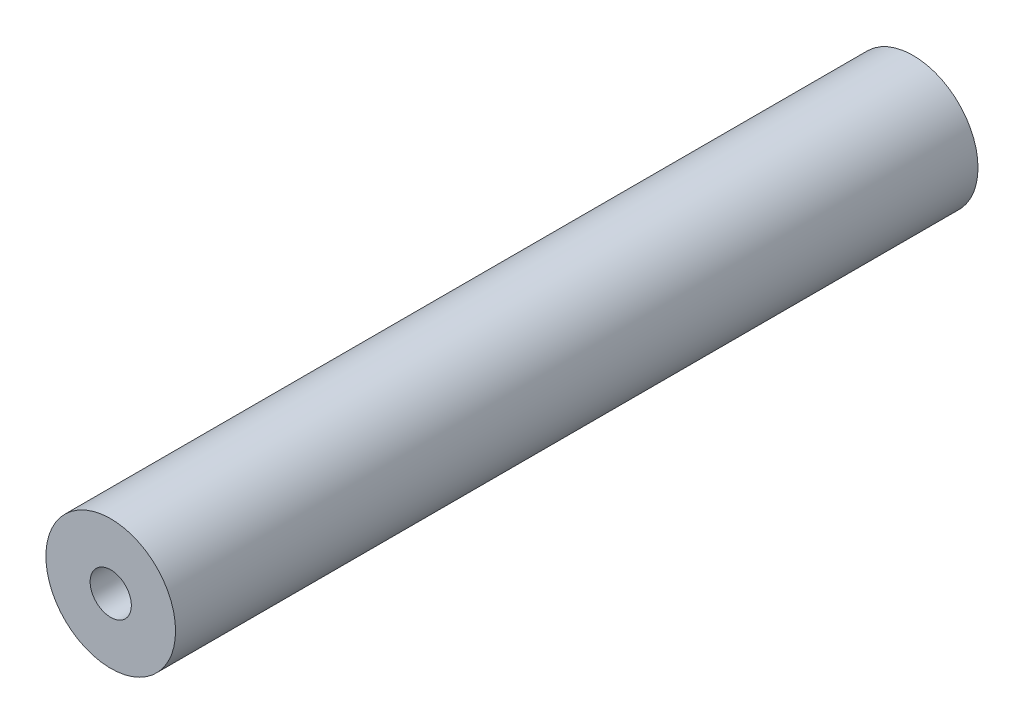
ISO-10303-21;
HEADER;
FILE_DESCRIPTION(('STEP AP214'),'2;1');
FILE_NAME('part.step','',(''),(''),'','','');
FILE_SCHEMA(('AUTOMOTIVE_DESIGN { 1 0 10303 214 1 1 1 1 }'));
ENDSEC;
DATA;
#1=APPLICATION_CONTEXT('core data for automotive mechanical design processes');
#2=APPLICATION_PROTOCOL_DEFINITION('international standard','automotive_design',2000,#1);
#3=PRODUCT_CONTEXT('',#1,'mechanical');
#4=PRODUCT('Part','Part','',(#3));
#5=PRODUCT_RELATED_PRODUCT_CATEGORY('part','',(#4));
#6=PRODUCT_DEFINITION_FORMATION('','',#4);
#7=PRODUCT_DEFINITION_CONTEXT('part definition',#1,'design');
#8=PRODUCT_DEFINITION('design','',#6,#7);
#9=PRODUCT_DEFINITION_SHAPE('','',#8);
#10=(LENGTH_UNIT() NAMED_UNIT(*) SI_UNIT(.MILLI.,.METRE.));
#11=(NAMED_UNIT(*) PLANE_ANGLE_UNIT() SI_UNIT($,.RADIAN.));
#12=(NAMED_UNIT(*) SI_UNIT($,.STERADIAN.) SOLID_ANGLE_UNIT());
#13=UNCERTAINTY_MEASURE_WITH_UNIT(LENGTH_MEASURE(1.E-05),#10,'distance_accuracy_value','');
#14=(GEOMETRIC_REPRESENTATION_CONTEXT(3) GLOBAL_UNCERTAINTY_ASSIGNED_CONTEXT((#13)) GLOBAL_UNIT_ASSIGNED_CONTEXT((#10,
#11,#12)) REPRESENTATION_CONTEXT('',''));
#15=CARTESIAN_POINT('',(0.,0.,0.));
#16=DIRECTION('',(0.,0.,1.));
#17=DIRECTION('',(1.,0.,0.));
#18=AXIS2_PLACEMENT_3D('',#15,#16,#17);
#19=CARTESIAN_POINT('',(0.,0.,39.290625));
#20=DIRECTION('',(0.,0.,-1.));
#21=DIRECTION('',(-1.,0.,0.));
#22=AXIS2_PLACEMENT_3D('',#19,#20,#21);
#23=CYLINDRICAL_SURFACE('',#22,6.35);
#24=CARTESIAN_POINT('',(0.,0.,39.290625));
#25=DIRECTION('',(0.,0.,1.));
#26=DIRECTION('',(1.,0.,0.));
#27=AXIS2_PLACEMENT_3D('',#24,#25,#26);
#28=CIRCLE('',#27,6.35);
#29=CARTESIAN_POINT('',(6.35,0.,39.290625));
#30=VERTEX_POINT('',#29);
#31=EDGE_CURVE('E11',#30,#30,#28,.T.);
#32=ORIENTED_EDGE('',*,*,#31,.F.);
#33=EDGE_LOOP('',(#32));
#34=FACE_BOUND('',#33,.T.);
#35=CARTESIAN_POINT('',(0.,0.,-39.290625));
#36=DIRECTION('',(0.,0.,1.));
#37=DIRECTION('',(1.,0.,0.));
#38=AXIS2_PLACEMENT_3D('',#35,#36,#37);
#39=CIRCLE('',#38,6.35);
#40=CARTESIAN_POINT('',(6.35,0.,-39.290625));
#41=VERTEX_POINT('',#40);
#42=EDGE_CURVE('E48',#41,#41,#39,.T.);
#43=ORIENTED_EDGE('',*,*,#42,.T.);
#44=EDGE_LOOP('',(#43));
#45=FACE_BOUND('',#44,.T.);
#46=ADVANCED_FACE('F45',(#34,#45),#23,.T.);
#47=CARTESIAN_POINT('',(0.,0.,39.290625));
#48=DIRECTION('',(0.,0.,1.));
#49=DIRECTION('',(1.,0.,0.));
#50=AXIS2_PLACEMENT_3D('',#47,#48,#49);
#51=PLANE('',#50);
#52=CARTESIAN_POINT('',(0.,0.,39.290625));
#53=DIRECTION('',(0.,0.,1.));
#54=DIRECTION('',(1.,0.,0.));
#55=AXIS2_PLACEMENT_3D('',#52,#53,#54);
#56=CIRCLE('',#55,2.01929999999999);
#57=CARTESIAN_POINT('',(2.01929999999999,0.,39.290625));
#58=VERTEX_POINT('',#57);
#59=EDGE_CURVE('E68',#58,#58,#56,.T.);
#60=ORIENTED_EDGE('',*,*,#59,.F.);
#61=EDGE_LOOP('',(#60));
#62=FACE_BOUND('',#61,.T.);
#63=ORIENTED_EDGE('',*,*,#31,.T.);
#64=EDGE_LOOP('',(#63));
#65=FACE_BOUND('',#64,.T.);
#66=ADVANCED_FACE('F87',(#62,#65),#51,.T.);
#67=CARTESIAN_POINT('',(0.,0.,-39.290625));
#68=DIRECTION('',(0.,0.,1.));
#69=DIRECTION('',(1.,0.,0.));
#70=AXIS2_PLACEMENT_3D('',#67,#68,#69);
#71=PLANE('',#70);
#72=CARTESIAN_POINT('',(0.,0.,-39.290625));
#73=DIRECTION('',(0.,0.,-1.));
#74=DIRECTION('',(-1.,0.,0.));
#75=AXIS2_PLACEMENT_3D('',#72,#73,#74);
#76=CIRCLE('',#75,2.01929999999999);
#77=CARTESIAN_POINT('',(-2.01929999999999,0.,-39.290625));
#78=VERTEX_POINT('',#77);
#79=EDGE_CURVE('E69',#78,#78,#76,.T.);
#80=ORIENTED_EDGE('',*,*,#79,.F.);
#81=EDGE_LOOP('',(#80));
#82=FACE_BOUND('',#81,.T.);
#83=ORIENTED_EDGE('',*,*,#42,.F.);
#84=EDGE_LOOP('',(#83));
#85=FACE_BOUND('',#84,.T.);
#86=ADVANCED_FACE('F84',(#82,#85),#71,.F.);
#87=CARTESIAN_POINT('',(0.,0.,27.261185));
#88=DIRECTION('',(0.,0.,1.));
#89=DIRECTION('',(1.,0.,0.));
#90=AXIS2_PLACEMENT_3D('',#87,#88,#89);
#91=CONICAL_SURFACE('',#90,2.01929999999999,1.02974425867665);
#92=CARTESIAN_POINT('',(0.,0.,26.0478671519976));
#93=VERTEX_POINT('',#92);
#94=VERTEX_LOOP('',#93);
#95=FACE_BOUND('',#94,.T.);
#96=CARTESIAN_POINT('',(0.,0.,27.261185));
#97=DIRECTION('',(0.,0.,1.));
#98=DIRECTION('',(1.,0.,0.));
#99=AXIS2_PLACEMENT_3D('',#96,#97,#98);
#100=CIRCLE('',#99,2.01929999999999);
#101=CARTESIAN_POINT('',(2.01929999999999,0.,27.261185));
#102=VERTEX_POINT('',#101);
#103=EDGE_CURVE('E72',#102,#102,#100,.T.);
#104=ORIENTED_EDGE('',*,*,#103,.T.);
#105=EDGE_LOOP('',(#104));
#106=FACE_BOUND('',#105,.T.);
#107=ADVANCED_FACE('F86',(#95,#106),#91,.F.);
#108=CARTESIAN_POINT('',(0.,0.,39.290625));
#109=DIRECTION('',(0.,0.,1.));
#110=DIRECTION('',(1.,0.,0.));
#111=AXIS2_PLACEMENT_3D('',#108,#109,#110);
#112=CYLINDRICAL_SURFACE('',#111,2.01929999999999);
#113=ORIENTED_EDGE('',*,*,#103,.F.);
#114=EDGE_LOOP('',(#113));
#115=FACE_BOUND('',#114,.T.);
#116=ORIENTED_EDGE('',*,*,#59,.T.);
#117=EDGE_LOOP('',(#116));
#118=FACE_BOUND('',#117,.T.);
#119=ADVANCED_FACE('F62',(#115,#118),#112,.F.);
#120=CARTESIAN_POINT('',(0.,0.,-27.261185));
#121=DIRECTION('',(0.,0.,-1.));
#122=DIRECTION('',(-1.,0.,0.));
#123=AXIS2_PLACEMENT_3D('',#120,#121,#122);
#124=CONICAL_SURFACE('',#123,2.01929999999999,1.02974425867665);
#125=CARTESIAN_POINT('',(0.,0.,-26.0478671519976));
#126=VERTEX_POINT('',#125);
#127=VERTEX_LOOP('',#126);
#128=FACE_BOUND('',#127,.T.);
#129=CARTESIAN_POINT('',(0.,0.,-27.261185));
#130=DIRECTION('',(0.,0.,-1.));
#131=DIRECTION('',(-1.,0.,0.));
#132=AXIS2_PLACEMENT_3D('',#129,#130,#131);
#133=CIRCLE('',#132,2.01929999999999);
#134=CARTESIAN_POINT('',(-2.01929999999999,0.,-27.261185));
#135=VERTEX_POINT('',#134);
#136=EDGE_CURVE('E66',#135,#135,#133,.T.);
#137=ORIENTED_EDGE('',*,*,#136,.T.);
#138=EDGE_LOOP('',(#137));
#139=FACE_BOUND('',#138,.T.);
#140=ADVANCED_FACE('F58',(#128,#139),#124,.F.);
#141=CARTESIAN_POINT('',(0.,0.,-39.290625));
#142=DIRECTION('',(0.,0.,-1.));
#143=DIRECTION('',(-1.,0.,0.));
#144=AXIS2_PLACEMENT_3D('',#141,#142,#143);
#145=CYLINDRICAL_SURFACE('',#144,2.01929999999999);
#146=ORIENTED_EDGE('',*,*,#136,.F.);
#147=EDGE_LOOP('',(#146));
#148=FACE_BOUND('',#147,.T.);
#149=ORIENTED_EDGE('',*,*,#79,.T.);
#150=EDGE_LOOP('',(#149));
#151=FACE_BOUND('',#150,.T.);
#152=ADVANCED_FACE('F61',(#148,#151),#145,.F.);
#153=CLOSED_SHELL('',(#46,#66,#86,#107,#119,#140,#152));
#154=MANIFOLD_SOLID_BREP('B2',#153);
#155=ADVANCED_BREP_SHAPE_REPRESENTATION('',(#18,#154),#14);
#156=SHAPE_DEFINITION_REPRESENTATION(#9,#155);
ENDSEC;
END-ISO-10303-21;
